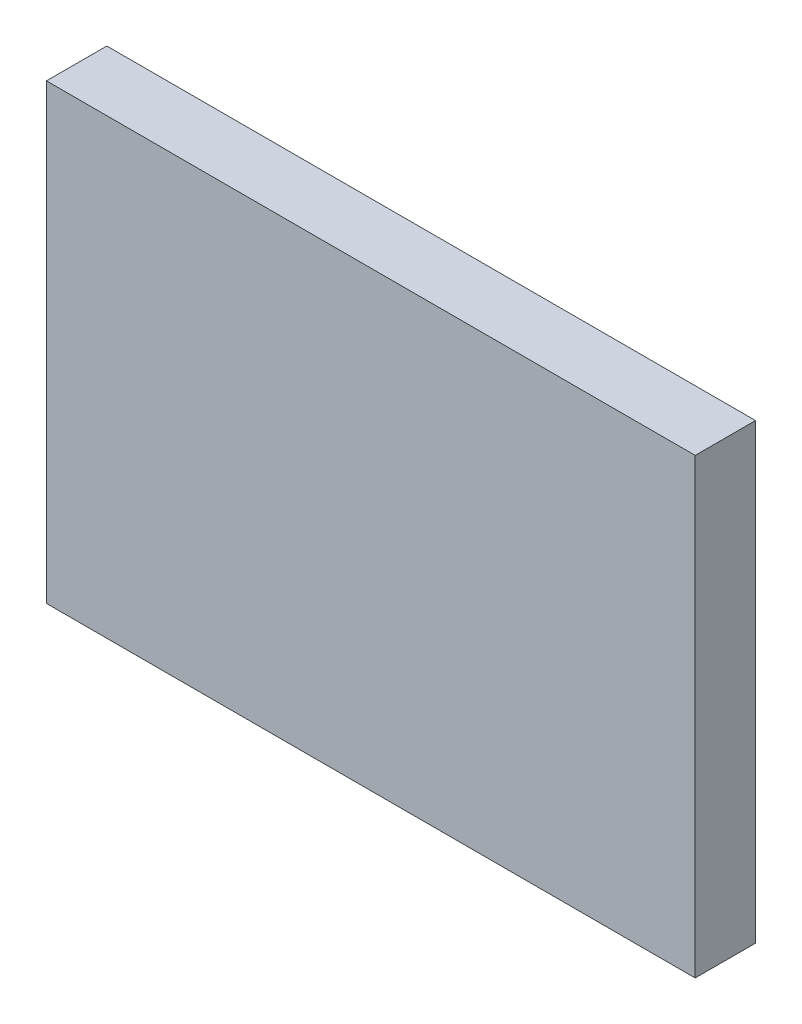
ISO-10303-21;
HEADER;
FILE_DESCRIPTION(('STEP AP214'),'2;1');
FILE_NAME('part.step','',(''),(''),'','','');
FILE_SCHEMA(('AUTOMOTIVE_DESIGN { 1 0 10303 214 1 1 1 1 }'));
ENDSEC;
DATA;
#1=APPLICATION_CONTEXT('core data for automotive mechanical design processes');
#2=APPLICATION_PROTOCOL_DEFINITION('international standard','automotive_design',2000,#1);
#3=PRODUCT_CONTEXT('',#1,'mechanical');
#4=PRODUCT('Part','Part','',(#3));
#5=PRODUCT_RELATED_PRODUCT_CATEGORY('part','',(#4));
#6=PRODUCT_DEFINITION_FORMATION('','',#4);
#7=PRODUCT_DEFINITION_CONTEXT('part definition',#1,'design');
#8=PRODUCT_DEFINITION('design','',#6,#7);
#9=PRODUCT_DEFINITION_SHAPE('','',#8);
#10=(LENGTH_UNIT() NAMED_UNIT(*) SI_UNIT(.MILLI.,.METRE.));
#11=(NAMED_UNIT(*) PLANE_ANGLE_UNIT() SI_UNIT($,.RADIAN.));
#12=(NAMED_UNIT(*) SI_UNIT($,.STERADIAN.) SOLID_ANGLE_UNIT());
#13=UNCERTAINTY_MEASURE_WITH_UNIT(LENGTH_MEASURE(1.E-05),#10,'distance_accuracy_value','');
#14=(GEOMETRIC_REPRESENTATION_CONTEXT(3) GLOBAL_UNCERTAINTY_ASSIGNED_CONTEXT((#13)) GLOBAL_UNIT_ASSIGNED_CONTEXT((#10,
#11,#12)) REPRESENTATION_CONTEXT('',''));
#15=CARTESIAN_POINT('',(0.,0.,0.));
#16=DIRECTION('',(0.,0.,1.));
#17=DIRECTION('',(1.,0.,0.));
#18=AXIS2_PLACEMENT_3D('',#15,#16,#17);
#19=CARTESIAN_POINT('',(0.,0.,4.));
#20=DIRECTION('',(1.,0.,0.));
#21=DIRECTION('',(0.,1.,0.));
#22=AXIS2_PLACEMENT_3D('',#19,#20,#21);
#23=PLANE('',#22);
#24=DIRECTION('',(0.,-1.,0.));
#25=VECTOR('',#24,1.);
#26=CARTESIAN_POINT('',(0.,0.,0.));
#27=LINE('',#26,#25);
#28=CARTESIAN_POINT('',(0.,0.,0.));
#29=VERTEX_POINT('',#28);
#30=CARTESIAN_POINT('',(0.,-30.,0.));
#31=VERTEX_POINT('',#30);
#32=EDGE_CURVE('E113',#29,#31,#27,.T.);
#33=ORIENTED_EDGE('',*,*,#32,.T.);
#34=DIRECTION('',(0.,0.,-1.));
#35=VECTOR('',#34,1.);
#36=CARTESIAN_POINT('',(0.,-30.,4.));
#37=LINE('',#36,#35);
#38=CARTESIAN_POINT('',(0.,-30.,4.));
#39=VERTEX_POINT('',#38);
#40=EDGE_CURVE('E11',#39,#31,#37,.T.);
#41=ORIENTED_EDGE('',*,*,#40,.F.);
#42=DIRECTION('',(0.,-1.,0.));
#43=VECTOR('',#42,1.);
#44=CARTESIAN_POINT('',(0.,0.,4.));
#45=LINE('',#44,#43);
#46=CARTESIAN_POINT('',(0.,0.,4.));
#47=VERTEX_POINT('',#46);
#48=EDGE_CURVE('E97',#47,#39,#45,.T.);
#49=ORIENTED_EDGE('',*,*,#48,.F.);
#50=DIRECTION('',(0.,0.,-1.));
#51=VECTOR('',#50,1.);
#52=CARTESIAN_POINT('',(0.,0.,4.));
#53=LINE('',#52,#51);
#54=EDGE_CURVE('E109',#47,#29,#53,.T.);
#55=ORIENTED_EDGE('',*,*,#54,.T.);
#56=EDGE_LOOP('',(#33,#41,#49,#55));
#57=FACE_BOUND('',#56,.T.);
#58=ADVANCED_FACE('F45',(#57),#23,.F.);
#59=CARTESIAN_POINT('',(0.,-30.,4.));
#60=DIRECTION('',(0.,1.,0.));
#61=DIRECTION('',(0.,0.,1.));
#62=AXIS2_PLACEMENT_3D('',#59,#60,#61);
#63=PLANE('',#62);
#64=DIRECTION('',(1.,0.,0.));
#65=VECTOR('',#64,1.);
#66=CARTESIAN_POINT('',(0.,-30.,0.));
#67=LINE('',#66,#65);
#68=CARTESIAN_POINT('',(43.,-30.,0.));
#69=VERTEX_POINT('',#68);
#70=EDGE_CURVE('E102',#31,#69,#67,.T.);
#71=ORIENTED_EDGE('',*,*,#70,.T.);
#72=DIRECTION('',(0.,0.,-1.));
#73=VECTOR('',#72,1.);
#74=CARTESIAN_POINT('',(43.,-30.,4.));
#75=LINE('',#74,#73);
#76=CARTESIAN_POINT('',(43.,-30.,4.));
#77=VERTEX_POINT('',#76);
#78=EDGE_CURVE('E54',#77,#69,#75,.T.);
#79=ORIENTED_EDGE('',*,*,#78,.F.);
#80=DIRECTION('',(1.,0.,0.));
#81=VECTOR('',#80,1.);
#82=CARTESIAN_POINT('',(0.,-30.,4.));
#83=LINE('',#82,#81);
#84=EDGE_CURVE('E92',#39,#77,#83,.T.);
#85=ORIENTED_EDGE('',*,*,#84,.F.);
#86=ORIENTED_EDGE('',*,*,#40,.T.);
#87=EDGE_LOOP('',(#71,#79,#85,#86));
#88=FACE_BOUND('',#87,.T.);
#89=ADVANCED_FACE('F101',(#88),#63,.F.);
#90=CARTESIAN_POINT('',(43.,0.,4.));
#91=DIRECTION('',(-1.,0.,0.));
#92=DIRECTION('',(0.,-1.,0.));
#93=AXIS2_PLACEMENT_3D('',#90,#91,#92);
#94=PLANE('',#93);
#95=DIRECTION('',(0.,1.,0.));
#96=VECTOR('',#95,1.);
#97=CARTESIAN_POINT('',(43.,0.,0.));
#98=LINE('',#97,#96);
#99=CARTESIAN_POINT('',(43.,0.,0.));
#100=VERTEX_POINT('',#99);
#101=EDGE_CURVE('E79',#69,#100,#98,.T.);
#102=ORIENTED_EDGE('',*,*,#101,.T.);
#103=DIRECTION('',(0.,0.,-1.));
#104=VECTOR('',#103,1.);
#105=CARTESIAN_POINT('',(43.,0.,4.));
#106=LINE('',#105,#104);
#107=CARTESIAN_POINT('',(43.,0.,4.));
#108=VERTEX_POINT('',#107);
#109=EDGE_CURVE('E104',#108,#100,#106,.T.);
#110=ORIENTED_EDGE('',*,*,#109,.F.);
#111=DIRECTION('',(0.,1.,0.));
#112=VECTOR('',#111,1.);
#113=CARTESIAN_POINT('',(43.,0.,4.));
#114=LINE('',#113,#112);
#115=EDGE_CURVE('E95',#77,#108,#114,.T.);
#116=ORIENTED_EDGE('',*,*,#115,.F.);
#117=ORIENTED_EDGE('',*,*,#78,.T.);
#118=EDGE_LOOP('',(#102,#110,#116,#117));
#119=FACE_BOUND('',#118,.T.);
#120=ADVANCED_FACE('F105',(#119),#94,.F.);
#121=CARTESIAN_POINT('',(0.,0.,4.));
#122=DIRECTION('',(0.,-1.,0.));
#123=DIRECTION('',(0.,0.,-1.));
#124=AXIS2_PLACEMENT_3D('',#121,#122,#123);
#125=PLANE('',#124);
#126=DIRECTION('',(-1.,0.,0.));
#127=VECTOR('',#126,1.);
#128=CARTESIAN_POINT('',(0.,0.,0.));
#129=LINE('',#128,#127);
#130=EDGE_CURVE('E85',#100,#29,#129,.T.);
#131=ORIENTED_EDGE('',*,*,#130,.T.);
#132=ORIENTED_EDGE('',*,*,#54,.F.);
#133=DIRECTION('',(-1.,0.,0.));
#134=VECTOR('',#133,1.);
#135=CARTESIAN_POINT('',(0.,0.,4.));
#136=LINE('',#135,#134);
#137=EDGE_CURVE('E62',#108,#47,#136,.T.);
#138=ORIENTED_EDGE('',*,*,#137,.F.);
#139=ORIENTED_EDGE('',*,*,#109,.T.);
#140=EDGE_LOOP('',(#131,#132,#138,#139));
#141=FACE_BOUND('',#140,.T.);
#142=ADVANCED_FACE('F126',(#141),#125,.F.);
#143=CARTESIAN_POINT('',(0.,0.,4.));
#144=DIRECTION('',(0.,0.,1.));
#145=DIRECTION('',(1.,0.,0.));
#146=AXIS2_PLACEMENT_3D('',#143,#144,#145);
#147=PLANE('',#146);
#148=ORIENTED_EDGE('',*,*,#48,.T.);
#149=ORIENTED_EDGE('',*,*,#84,.T.);
#150=ORIENTED_EDGE('',*,*,#115,.T.);
#151=ORIENTED_EDGE('',*,*,#137,.T.);
#152=EDGE_LOOP('',(#148,#149,#150,#151));
#153=FACE_BOUND('',#152,.T.);
#154=ADVANCED_FACE('F93',(#153),#147,.T.);
#155=CARTESIAN_POINT('',(0.,0.,0.));
#156=DIRECTION('',(0.,0.,1.));
#157=DIRECTION('',(1.,0.,0.));
#158=AXIS2_PLACEMENT_3D('',#155,#156,#157);
#159=PLANE('',#158);
#160=ORIENTED_EDGE('',*,*,#32,.F.);
#161=ORIENTED_EDGE('',*,*,#130,.F.);
#162=ORIENTED_EDGE('',*,*,#101,.F.);
#163=ORIENTED_EDGE('',*,*,#70,.F.);
#164=EDGE_LOOP('',(#160,#161,#162,#163));
#165=FACE_BOUND('',#164,.T.);
#166=ADVANCED_FACE('F129',(#165),#159,.F.);
#167=CLOSED_SHELL('',(#58,#89,#120,#142,#154,#166));
#168=MANIFOLD_SOLID_BREP('B2',#167);
#169=ADVANCED_BREP_SHAPE_REPRESENTATION('',(#18,#168),#14);
#170=SHAPE_DEFINITION_REPRESENTATION(#9,#169);
ENDSEC;
END-ISO-10303-21;
